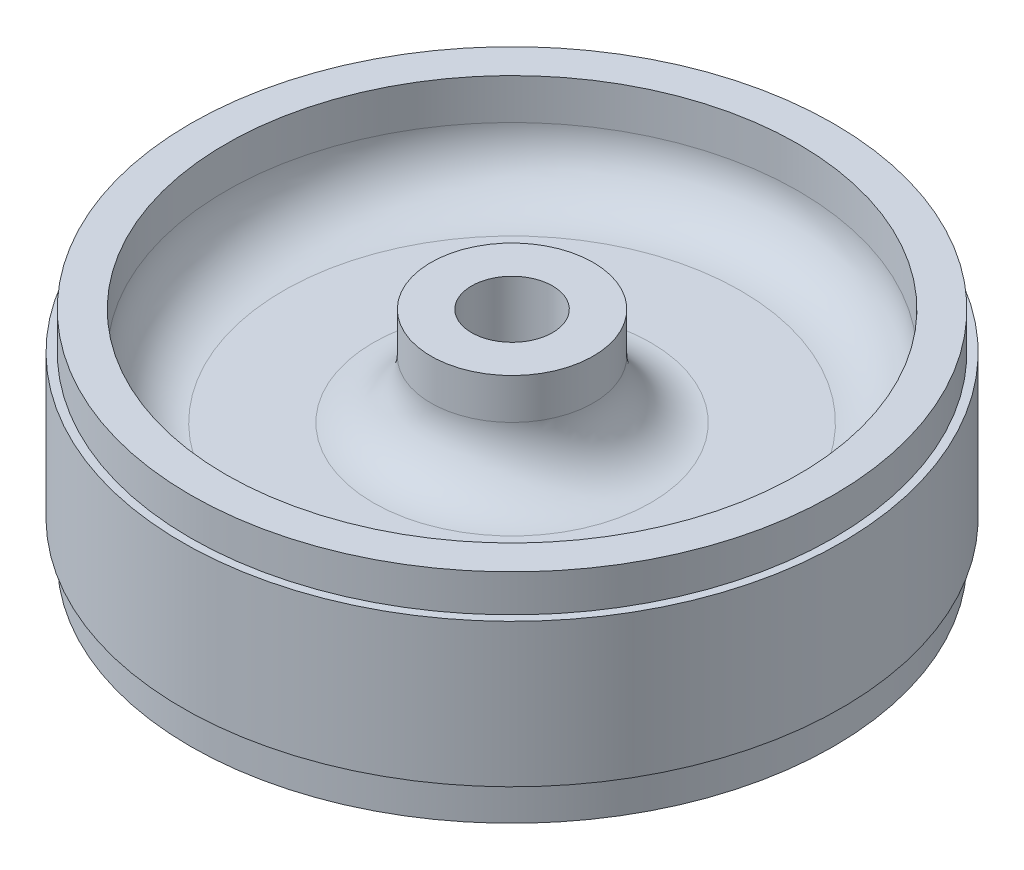
ISO-10303-21;
HEADER;
FILE_DESCRIPTION(('STEP AP214'),'2;1');
FILE_NAME('part.step','',(''),(''),'','','');
FILE_SCHEMA(('AUTOMOTIVE_DESIGN { 1 0 10303 214 1 1 1 1 }'));
ENDSEC;
DATA;
#1=APPLICATION_CONTEXT('core data for automotive mechanical design processes');
#2=APPLICATION_PROTOCOL_DEFINITION('international standard','automotive_design',2000,#1);
#3=PRODUCT_CONTEXT('',#1,'mechanical');
#4=PRODUCT('Part','Part','',(#3));
#5=PRODUCT_RELATED_PRODUCT_CATEGORY('part','',(#4));
#6=PRODUCT_DEFINITION_FORMATION('','',#4);
#7=PRODUCT_DEFINITION_CONTEXT('part definition',#1,'design');
#8=PRODUCT_DEFINITION('design','',#6,#7);
#9=PRODUCT_DEFINITION_SHAPE('','',#8);
#10=(LENGTH_UNIT() NAMED_UNIT(*) SI_UNIT(.MILLI.,.METRE.));
#11=(NAMED_UNIT(*) PLANE_ANGLE_UNIT() SI_UNIT($,.RADIAN.));
#12=(NAMED_UNIT(*) SI_UNIT($,.STERADIAN.) SOLID_ANGLE_UNIT());
#13=UNCERTAINTY_MEASURE_WITH_UNIT(LENGTH_MEASURE(1.E-05),#10,'distance_accuracy_value','');
#14=(GEOMETRIC_REPRESENTATION_CONTEXT(3) GLOBAL_UNCERTAINTY_ASSIGNED_CONTEXT((#13)) GLOBAL_UNIT_ASSIGNED_CONTEXT((#10,
#11,#12)) REPRESENTATION_CONTEXT('',''));
#15=CARTESIAN_POINT('',(0.,0.,0.));
#16=DIRECTION('',(0.,0.,1.));
#17=DIRECTION('',(1.,0.,0.));
#18=AXIS2_PLACEMENT_3D('',#15,#16,#17);
#19=CARTESIAN_POINT('',(-9.74094732182382,26.1853451292921,0.));
#20=DIRECTION('',(0.,-1.,0.));
#21=DIRECTION('',(0.,0.,-1.));
#22=AXIS2_PLACEMENT_3D('',#19,#20,#21);
#23=PLANE('',#22);
#24=CARTESIAN_POINT('',(0.,26.1853451292921,0.));
#25=DIRECTION('',(0.,-1.,0.));
#26=DIRECTION('',(0.,0.,-1.));
#27=AXIS2_PLACEMENT_3D('',#24,#25,#26);
#28=CIRCLE('',#27,19.5223201790355);
#29=CARTESIAN_POINT('',(0.,26.1853451292921,-19.5223201790355));
#30=VERTEX_POINT('',#29);
#31=EDGE_CURVE('E91',#30,#30,#28,.T.);
#32=ORIENTED_EDGE('',*,*,#31,.F.);
#33=EDGE_LOOP('',(#32));
#34=FACE_BOUND('',#33,.T.);
#35=CARTESIAN_POINT('',(0.,26.1853451292921,0.));
#36=DIRECTION('',(0.,-1.,0.));
#37=DIRECTION('',(0.,0.,-1.));
#38=AXIS2_PLACEMENT_3D('',#35,#36,#37);
#39=CIRCLE('',#38,9.74094732182382);
#40=CARTESIAN_POINT('',(0.,26.1853451292921,-9.74094732182382));
#41=VERTEX_POINT('',#40);
#42=EDGE_CURVE('E10',#41,#41,#39,.T.);
#43=ORIENTED_EDGE('',*,*,#42,.T.);
#44=EDGE_LOOP('',(#43));
#45=FACE_BOUND('',#44,.T.);
#46=ADVANCED_FACE('F27',(#34,#45),#23,.F.);
#47=CARTESIAN_POINT('',(0.,0.,0.));
#48=DIRECTION('',(0.,-1.,0.));
#49=DIRECTION('',(0.,0.,-1.));
#50=AXIS2_PLACEMENT_3D('',#47,#48,#49);
#51=CYLINDRICAL_SURFACE('',#50,9.74094732182382);
#52=ORIENTED_EDGE('',*,*,#42,.F.);
#53=EDGE_LOOP('',(#52));
#54=FACE_BOUND('',#53,.T.);
#55=CARTESIAN_POINT('',(0.,-26.1853451292921,0.));
#56=DIRECTION('',(0.,-1.,0.));
#57=DIRECTION('',(0.,0.,-1.));
#58=AXIS2_PLACEMENT_3D('',#55,#56,#57);
#59=CIRCLE('',#58,9.74094732182382);
#60=CARTESIAN_POINT('',(0.,-26.1853451292921,-9.74094732182382));
#61=VERTEX_POINT('',#60);
#62=EDGE_CURVE('E33',#61,#61,#59,.T.);
#63=ORIENTED_EDGE('',*,*,#62,.T.);
#64=EDGE_LOOP('',(#63));
#65=FACE_BOUND('',#64,.T.);
#66=ADVANCED_FACE('F98',(#54,#65),#51,.F.);
#67=CARTESIAN_POINT('',(-9.74094732182382,-26.1853451292921,0.));
#68=DIRECTION('',(0.,1.,0.));
#69=DIRECTION('',(0.,0.,1.));
#70=AXIS2_PLACEMENT_3D('',#67,#68,#69);
#71=PLANE('',#70);
#72=ORIENTED_EDGE('',*,*,#62,.F.);
#73=EDGE_LOOP('',(#72));
#74=FACE_BOUND('',#73,.T.);
#75=CARTESIAN_POINT('',(0.,-26.1853451292921,0.));
#76=DIRECTION('',(0.,-1.,0.));
#77=DIRECTION('',(0.,0.,-1.));
#78=AXIS2_PLACEMENT_3D('',#75,#76,#77);
#79=CIRCLE('',#78,19.5223201790355);
#80=CARTESIAN_POINT('',(0.,-26.1853451292921,-19.5223201790355));
#81=VERTEX_POINT('',#80);
#82=EDGE_CURVE('E37',#81,#81,#79,.T.);
#83=ORIENTED_EDGE('',*,*,#82,.T.);
#84=EDGE_LOOP('',(#83));
#85=FACE_BOUND('',#84,.T.);
#86=ADVANCED_FACE('F102',(#74,#85),#71,.F.);
#87=CARTESIAN_POINT('',(0.,0.,0.));
#88=DIRECTION('',(0.,-1.,0.));
#89=DIRECTION('',(0.,0.,-1.));
#90=AXIS2_PLACEMENT_3D('',#87,#88,#89);
#91=CYLINDRICAL_SURFACE('',#90,19.5223201790355);
#92=ORIENTED_EDGE('',*,*,#82,.F.);
#93=EDGE_LOOP('',(#92));
#94=FACE_BOUND('',#93,.T.);
#95=CARTESIAN_POINT('',(0.,-16.4091999867365,0.));
#96=DIRECTION('',(0.,-1.,0.));
#97=DIRECTION('',(0.,0.,-1.));
#98=AXIS2_PLACEMENT_3D('',#95,#96,#97);
#99=CIRCLE('',#98,19.5223201790355);
#100=CARTESIAN_POINT('',(0.,-16.4091999867365,-19.5223201790355));
#101=VERTEX_POINT('',#100);
#102=EDGE_CURVE('E41',#101,#101,#99,.T.);
#103=ORIENTED_EDGE('',*,*,#102,.T.);
#104=EDGE_LOOP('',(#103));
#105=FACE_BOUND('',#104,.T.);
#106=ADVANCED_FACE('F107',(#94,#105),#91,.T.);
#107=CARTESIAN_POINT('',(0.,-16.4091999867365,0.));
#108=DIRECTION('',(0.,-1.,0.));
#109=DIRECTION('',(0.,0.,-1.));
#110=AXIS2_PLACEMENT_3D('',#107,#108,#109);
#111=TOROIDAL_SURFACE('',#110,33.3727296522538,13.8504094732182);
#112=ORIENTED_EDGE('',*,*,#102,.F.);
#113=EDGE_LOOP('',(#112));
#114=FACE_BOUND('',#113,.T.);
#115=CARTESIAN_POINT('',(0.,-2.55879051351826,0.));
#116=DIRECTION('',(0.,-1.,0.));
#117=DIRECTION('',(0.,0.,-1.));
#118=AXIS2_PLACEMENT_3D('',#115,#116,#117);
#119=CIRCLE('',#118,33.3727296522538);
#120=CARTESIAN_POINT('',(0.,-2.55879051351826,-33.3727296522538));
#121=VERTEX_POINT('',#120);
#122=EDGE_CURVE('E46',#121,#121,#119,.T.);
#123=ORIENTED_EDGE('',*,*,#122,.T.);
#124=EDGE_LOOP('',(#123));
#125=FACE_BOUND('',#124,.T.);
#126=ADVANCED_FACE('F113',(#114,#125),#111,.F.);
#127=CARTESIAN_POINT('',(-33.3727296522538,-2.55879051351826,0.));
#128=DIRECTION('',(0.,1.,0.));
#129=DIRECTION('',(0.,0.,1.));
#130=AXIS2_PLACEMENT_3D('',#127,#128,#129);
#131=PLANE('',#130);
#132=ORIENTED_EDGE('',*,*,#122,.F.);
#133=EDGE_LOOP('',(#132));
#134=FACE_BOUND('',#133,.T.);
#135=CARTESIAN_POINT('',(0.,-2.55879051351826,0.));
#136=DIRECTION('',(0.,-1.,0.));
#137=DIRECTION('',(0.,0.,-1.));
#138=AXIS2_PLACEMENT_3D('',#135,#136,#137);
#139=CIRCLE('',#138,55.0007092192034);
#140=CARTESIAN_POINT('',(0.,-2.55879051351826,-55.0007092192034));
#141=VERTEX_POINT('',#140);
#142=EDGE_CURVE('E49',#141,#141,#139,.T.);
#143=ORIENTED_EDGE('',*,*,#142,.T.);
#144=EDGE_LOOP('',(#143));
#145=FACE_BOUND('',#144,.T.);
#146=ADVANCED_FACE('F117',(#134,#145),#131,.F.);
#147=CARTESIAN_POINT('',(0.,-16.4091999867365,0.));
#148=DIRECTION('',(0.,-1.,0.));
#149=DIRECTION('',(0.,0.,-1.));
#150=AXIS2_PLACEMENT_3D('',#147,#148,#149);
#151=TOROIDAL_SURFACE('',#150,55.0007092192034,13.8504094732182);
#152=ORIENTED_EDGE('',*,*,#142,.F.);
#153=EDGE_LOOP('',(#152));
#154=FACE_BOUND('',#153,.T.);
#155=CARTESIAN_POINT('',(0.,-16.4091999867365,0.));
#156=DIRECTION('',(0.,-1.,0.));
#157=DIRECTION('',(0.,0.,-1.));
#158=AXIS2_PLACEMENT_3D('',#155,#156,#157);
#159=CIRCLE('',#158,68.8511186924217);
#160=CARTESIAN_POINT('',(0.,-16.4091999867365,-68.8511186924217));
#161=VERTEX_POINT('',#160);
#162=EDGE_CURVE('E52',#161,#161,#159,.T.);
#163=ORIENTED_EDGE('',*,*,#162,.T.);
#164=EDGE_LOOP('',(#163));
#165=FACE_BOUND('',#164,.T.);
#166=ADVANCED_FACE('F121',(#154,#165),#151,.F.);
#167=CARTESIAN_POINT('',(0.,0.,0.));
#168=DIRECTION('',(0.,-1.,0.));
#169=DIRECTION('',(0.,0.,-1.));
#170=AXIS2_PLACEMENT_3D('',#167,#168,#169);
#171=CYLINDRICAL_SURFACE('',#170,68.8511186924217);
#172=ORIENTED_EDGE('',*,*,#162,.F.);
#173=EDGE_LOOP('',(#172));
#174=FACE_BOUND('',#173,.T.);
#175=CARTESIAN_POINT('',(0.,-26.1853451292922,0.));
#176=DIRECTION('',(0.,-1.,0.));
#177=DIRECTION('',(0.,0.,-1.));
#178=AXIS2_PLACEMENT_3D('',#175,#176,#177);
#179=CIRCLE('',#178,68.8511186924217);
#180=CARTESIAN_POINT('',(0.,-26.1853451292922,-68.8511186924217));
#181=VERTEX_POINT('',#180);
#182=EDGE_CURVE('E55',#181,#181,#179,.T.);
#183=ORIENTED_EDGE('',*,*,#182,.T.);
#184=EDGE_LOOP('',(#183));
#185=FACE_BOUND('',#184,.T.);
#186=ADVANCED_FACE('F125',(#174,#185),#171,.F.);
#187=CARTESIAN_POINT('',(-68.8511186924217,-26.1853451292922,0.));
#188=DIRECTION('',(0.,1.,0.));
#189=DIRECTION('',(0.,0.,1.));
#190=AXIS2_PLACEMENT_3D('',#187,#188,#189);
#191=PLANE('',#190);
#192=ORIENTED_EDGE('',*,*,#182,.F.);
#193=EDGE_LOOP('',(#192));
#194=FACE_BOUND('',#193,.T.);
#195=CARTESIAN_POINT('',(0.,-26.1853451292922,0.));
#196=DIRECTION('',(0.,-1.,0.));
#197=DIRECTION('',(0.,0.,-1.));
#198=AXIS2_PLACEMENT_3D('',#195,#196,#197);
#199=CIRCLE('',#198,77.3516349004559);
#200=CARTESIAN_POINT('',(0.,-26.1853451292922,-77.3516349004559));
#201=VERTEX_POINT('',#200);
#202=EDGE_CURVE('E58',#201,#201,#199,.T.);
#203=ORIENTED_EDGE('',*,*,#202,.T.);
#204=EDGE_LOOP('',(#203));
#205=FACE_BOUND('',#204,.T.);
#206=ADVANCED_FACE('F129',(#194,#205),#191,.F.);
#207=CARTESIAN_POINT('',(0.,0.,0.));
#208=DIRECTION('',(0.,-1.,0.));
#209=DIRECTION('',(0.,0.,-1.));
#210=AXIS2_PLACEMENT_3D('',#207,#208,#209);
#211=CYLINDRICAL_SURFACE('',#210,77.3516349004559);
#212=ORIENTED_EDGE('',*,*,#202,.F.);
#213=EDGE_LOOP('',(#212));
#214=FACE_BOUND('',#213,.T.);
#215=CARTESIAN_POINT('',(0.,-17.2330640185434,0.));
#216=DIRECTION('',(0.,-1.,0.));
#217=DIRECTION('',(0.,0.,-1.));
#218=AXIS2_PLACEMENT_3D('',#215,#216,#217);
#219=CIRCLE('',#218,77.3516349004559);
#220=CARTESIAN_POINT('',(0.,-17.2330640185434,-77.3516349004559));
#221=VERTEX_POINT('',#220);
#222=EDGE_CURVE('E61',#221,#221,#219,.T.);
#223=ORIENTED_EDGE('',*,*,#222,.T.);
#224=EDGE_LOOP('',(#223));
#225=FACE_BOUND('',#224,.T.);
#226=ADVANCED_FACE('F133',(#214,#225),#211,.T.);
#227=CARTESIAN_POINT('',(-77.3516349004559,-17.2330640185434,0.));
#228=DIRECTION('',(0.,1.,0.));
#229=DIRECTION('',(0.,0.,1.));
#230=AXIS2_PLACEMENT_3D('',#227,#228,#229);
#231=PLANE('',#230);
#232=ORIENTED_EDGE('',*,*,#222,.F.);
#233=EDGE_LOOP('',(#232));
#234=FACE_BOUND('',#233,.T.);
#235=CARTESIAN_POINT('',(0.,-17.2330640185434,0.));
#236=DIRECTION('',(0.,-1.,0.));
#237=DIRECTION('',(0.,0.,-1.));
#238=AXIS2_PLACEMENT_3D('',#235,#236,#237);
#239=CIRCLE('',#238,79.2650029784596);
#240=CARTESIAN_POINT('',(0.,-17.2330640185434,-79.2650029784596));
#241=VERTEX_POINT('',#240);
#242=EDGE_CURVE('E64',#241,#241,#239,.T.);
#243=ORIENTED_EDGE('',*,*,#242,.T.);
#244=EDGE_LOOP('',(#243));
#245=FACE_BOUND('',#244,.T.);
#246=ADVANCED_FACE('F137',(#234,#245),#231,.F.);
#247=CARTESIAN_POINT('',(0.,0.,0.));
#248=DIRECTION('',(0.,-1.,0.));
#249=DIRECTION('',(0.,0.,-1.));
#250=AXIS2_PLACEMENT_3D('',#247,#248,#249);
#251=CYLINDRICAL_SURFACE('',#250,79.2650029784596);
#252=ORIENTED_EDGE('',*,*,#242,.F.);
#253=EDGE_LOOP('',(#252));
#254=FACE_BOUND('',#253,.T.);
#255=CARTESIAN_POINT('',(0.,17.2330640185434,0.));
#256=DIRECTION('',(0.,-1.,0.));
#257=DIRECTION('',(0.,0.,-1.));
#258=AXIS2_PLACEMENT_3D('',#255,#256,#257);
#259=CIRCLE('',#258,79.2650029784596);
#260=CARTESIAN_POINT('',(0.,17.2330640185434,-79.2650029784596));
#261=VERTEX_POINT('',#260);
#262=EDGE_CURVE('E67',#261,#261,#259,.T.);
#263=ORIENTED_EDGE('',*,*,#262,.T.);
#264=EDGE_LOOP('',(#263));
#265=FACE_BOUND('',#264,.T.);
#266=ADVANCED_FACE('F141',(#254,#265),#251,.T.);
#267=CARTESIAN_POINT('',(-77.3516349004559,17.2330640185434,0.));
#268=DIRECTION('',(0.,-1.,0.));
#269=DIRECTION('',(0.,0.,-1.));
#270=AXIS2_PLACEMENT_3D('',#267,#268,#269);
#271=PLANE('',#270);
#272=ORIENTED_EDGE('',*,*,#262,.F.);
#273=EDGE_LOOP('',(#272));
#274=FACE_BOUND('',#273,.T.);
#275=CARTESIAN_POINT('',(0.,17.2330640185434,0.));
#276=DIRECTION('',(0.,-1.,0.));
#277=DIRECTION('',(0.,0.,-1.));
#278=AXIS2_PLACEMENT_3D('',#275,#276,#277);
#279=CIRCLE('',#278,77.3516349004559);
#280=CARTESIAN_POINT('',(0.,17.2330640185434,-77.3516349004559));
#281=VERTEX_POINT('',#280);
#282=EDGE_CURVE('E70',#281,#281,#279,.T.);
#283=ORIENTED_EDGE('',*,*,#282,.T.);
#284=EDGE_LOOP('',(#283));
#285=FACE_BOUND('',#284,.T.);
#286=ADVANCED_FACE('F145',(#274,#285),#271,.F.);
#287=CARTESIAN_POINT('',(0.,0.,0.));
#288=DIRECTION('',(0.,-1.,0.));
#289=DIRECTION('',(0.,0.,-1.));
#290=AXIS2_PLACEMENT_3D('',#287,#288,#289);
#291=CYLINDRICAL_SURFACE('',#290,77.3516349004559);
#292=ORIENTED_EDGE('',*,*,#282,.F.);
#293=EDGE_LOOP('',(#292));
#294=FACE_BOUND('',#293,.T.);
#295=CARTESIAN_POINT('',(0.,26.1853451292922,0.));
#296=DIRECTION('',(0.,-1.,0.));
#297=DIRECTION('',(0.,0.,-1.));
#298=AXIS2_PLACEMENT_3D('',#295,#296,#297);
#299=CIRCLE('',#298,77.3516349004559);
#300=CARTESIAN_POINT('',(0.,26.1853451292922,-77.3516349004559));
#301=VERTEX_POINT('',#300);
#302=EDGE_CURVE('E73',#301,#301,#299,.T.);
#303=ORIENTED_EDGE('',*,*,#302,.T.);
#304=EDGE_LOOP('',(#303));
#305=FACE_BOUND('',#304,.T.);
#306=ADVANCED_FACE('F149',(#294,#305),#291,.T.);
#307=CARTESIAN_POINT('',(-68.8511186924217,26.1853451292922,0.));
#308=DIRECTION('',(0.,-1.,0.));
#309=DIRECTION('',(0.,0.,-1.));
#310=AXIS2_PLACEMENT_3D('',#307,#308,#309);
#311=PLANE('',#310);
#312=ORIENTED_EDGE('',*,*,#302,.F.);
#313=EDGE_LOOP('',(#312));
#314=FACE_BOUND('',#313,.T.);
#315=CARTESIAN_POINT('',(0.,26.1853451292922,0.));
#316=DIRECTION('',(0.,-1.,0.));
#317=DIRECTION('',(0.,0.,-1.));
#318=AXIS2_PLACEMENT_3D('',#315,#316,#317);
#319=CIRCLE('',#318,68.8511186924217);
#320=CARTESIAN_POINT('',(0.,26.1853451292922,-68.8511186924217));
#321=VERTEX_POINT('',#320);
#322=EDGE_CURVE('E76',#321,#321,#319,.T.);
#323=ORIENTED_EDGE('',*,*,#322,.T.);
#324=EDGE_LOOP('',(#323));
#325=FACE_BOUND('',#324,.T.);
#326=ADVANCED_FACE('F153',(#314,#325),#311,.F.);
#327=CARTESIAN_POINT('',(0.,0.,0.));
#328=DIRECTION('',(0.,-1.,0.));
#329=DIRECTION('',(0.,0.,-1.));
#330=AXIS2_PLACEMENT_3D('',#327,#328,#329);
#331=CYLINDRICAL_SURFACE('',#330,68.8511186924217);
#332=ORIENTED_EDGE('',*,*,#322,.F.);
#333=EDGE_LOOP('',(#332));
#334=FACE_BOUND('',#333,.T.);
#335=CARTESIAN_POINT('',(0.,16.4091999867365,0.));
#336=DIRECTION('',(0.,-1.,0.));
#337=DIRECTION('',(0.,0.,-1.));
#338=AXIS2_PLACEMENT_3D('',#335,#336,#337);
#339=CIRCLE('',#338,68.8511186924217);
#340=CARTESIAN_POINT('',(0.,16.4091999867365,-68.8511186924217));
#341=VERTEX_POINT('',#340);
#342=EDGE_CURVE('E79',#341,#341,#339,.T.);
#343=ORIENTED_EDGE('',*,*,#342,.T.);
#344=EDGE_LOOP('',(#343));
#345=FACE_BOUND('',#344,.T.);
#346=ADVANCED_FACE('F157',(#334,#345),#331,.F.);
#347=CARTESIAN_POINT('',(0.,16.4091999867365,0.));
#348=DIRECTION('',(0.,-1.,0.));
#349=DIRECTION('',(0.,0.,-1.));
#350=AXIS2_PLACEMENT_3D('',#347,#348,#349);
#351=TOROIDAL_SURFACE('',#350,55.0007092192034,13.8504094732182);
#352=ORIENTED_EDGE('',*,*,#342,.F.);
#353=EDGE_LOOP('',(#352));
#354=FACE_BOUND('',#353,.T.);
#355=CARTESIAN_POINT('',(0.,2.55879051351826,0.));
#356=DIRECTION('',(0.,-1.,0.));
#357=DIRECTION('',(0.,0.,-1.));
#358=AXIS2_PLACEMENT_3D('',#355,#356,#357);
#359=CIRCLE('',#358,55.0007092192034);
#360=CARTESIAN_POINT('',(0.,2.55879051351826,-55.0007092192034));
#361=VERTEX_POINT('',#360);
#362=EDGE_CURVE('E82',#361,#361,#359,.T.);
#363=ORIENTED_EDGE('',*,*,#362,.T.);
#364=EDGE_LOOP('',(#363));
#365=FACE_BOUND('',#364,.T.);
#366=ADVANCED_FACE('F161',(#354,#365),#351,.F.);
#367=CARTESIAN_POINT('',(-33.3727296522538,2.55879051351826,0.));
#368=DIRECTION('',(0.,-1.,0.));
#369=DIRECTION('',(0.,0.,-1.));
#370=AXIS2_PLACEMENT_3D('',#367,#368,#369);
#371=PLANE('',#370);
#372=ORIENTED_EDGE('',*,*,#362,.F.);
#373=EDGE_LOOP('',(#372));
#374=FACE_BOUND('',#373,.T.);
#375=CARTESIAN_POINT('',(0.,2.55879051351826,0.));
#376=DIRECTION('',(0.,-1.,0.));
#377=DIRECTION('',(0.,0.,-1.));
#378=AXIS2_PLACEMENT_3D('',#375,#376,#377);
#379=CIRCLE('',#378,33.3727296522538);
#380=CARTESIAN_POINT('',(0.,2.55879051351826,-33.3727296522538));
#381=VERTEX_POINT('',#380);
#382=EDGE_CURVE('E85',#381,#381,#379,.T.);
#383=ORIENTED_EDGE('',*,*,#382,.T.);
#384=EDGE_LOOP('',(#383));
#385=FACE_BOUND('',#384,.T.);
#386=ADVANCED_FACE('F165',(#374,#385),#371,.F.);
#387=CARTESIAN_POINT('',(0.,16.4091999867365,0.));
#388=DIRECTION('',(0.,-1.,0.));
#389=DIRECTION('',(0.,0.,-1.));
#390=AXIS2_PLACEMENT_3D('',#387,#388,#389);
#391=TOROIDAL_SURFACE('',#390,33.3727296522538,13.8504094732182);
#392=ORIENTED_EDGE('',*,*,#382,.F.);
#393=EDGE_LOOP('',(#392));
#394=FACE_BOUND('',#393,.T.);
#395=CARTESIAN_POINT('',(0.,16.4091999867365,0.));
#396=DIRECTION('',(0.,-1.,0.));
#397=DIRECTION('',(0.,0.,-1.));
#398=AXIS2_PLACEMENT_3D('',#395,#396,#397);
#399=CIRCLE('',#398,19.5223201790355);
#400=CARTESIAN_POINT('',(0.,16.4091999867365,-19.5223201790355));
#401=VERTEX_POINT('',#400);
#402=EDGE_CURVE('E88',#401,#401,#399,.T.);
#403=ORIENTED_EDGE('',*,*,#402,.T.);
#404=EDGE_LOOP('',(#403));
#405=FACE_BOUND('',#404,.T.);
#406=ADVANCED_FACE('F169',(#394,#405),#391,.F.);
#407=CARTESIAN_POINT('',(0.,0.,0.));
#408=DIRECTION('',(0.,-1.,0.));
#409=DIRECTION('',(0.,0.,-1.));
#410=AXIS2_PLACEMENT_3D('',#407,#408,#409);
#411=CYLINDRICAL_SURFACE('',#410,19.5223201790355);
#412=ORIENTED_EDGE('',*,*,#402,.F.);
#413=EDGE_LOOP('',(#412));
#414=FACE_BOUND('',#413,.T.);
#415=ORIENTED_EDGE('',*,*,#31,.T.);
#416=EDGE_LOOP('',(#415));
#417=FACE_BOUND('',#416,.T.);
#418=ADVANCED_FACE('F95',(#414,#417),#411,.T.);
#419=CLOSED_SHELL('',(#46,#66,#86,#106,#126,#146,#166,#186,#206,#226,#246,#266,#286,#306,#326,
#346,#366,#386,#406,#418));
#420=MANIFOLD_SOLID_BREP('B2',#419);
#421=ADVANCED_BREP_SHAPE_REPRESENTATION('',(#18,#420),#14);
#422=SHAPE_DEFINITION_REPRESENTATION(#9,#421);
ENDSEC;
END-ISO-10303-21;
